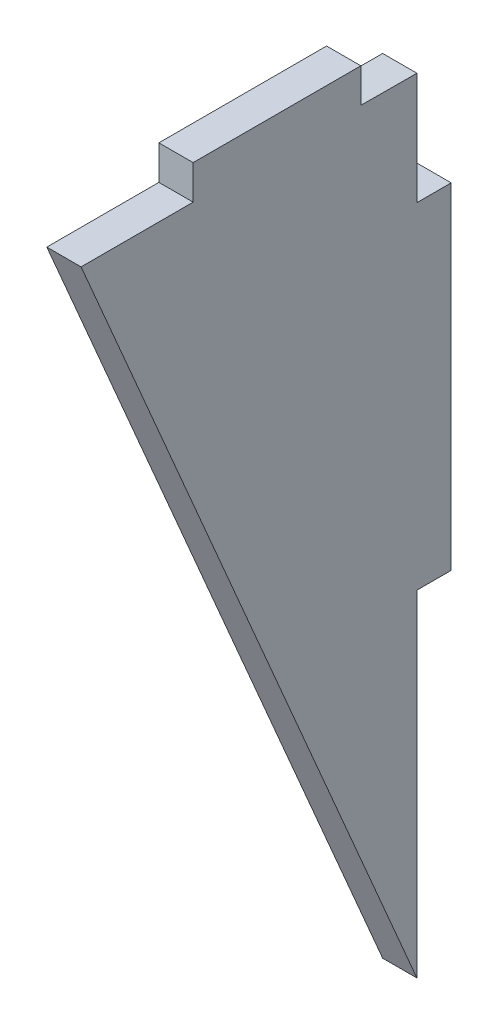
ISO-10303-21;
HEADER;
FILE_DESCRIPTION(('STEP AP214'),'2;1');
FILE_NAME('part.step','',(''),(''),'','','');
FILE_SCHEMA(('AUTOMOTIVE_DESIGN { 1 0 10303 214 1 1 1 1 }'));
ENDSEC;
DATA;
#1=APPLICATION_CONTEXT('core data for automotive mechanical design processes');
#2=APPLICATION_PROTOCOL_DEFINITION('international standard','automotive_design',2000,#1);
#3=PRODUCT_CONTEXT('',#1,'mechanical');
#4=PRODUCT('Part','Part','',(#3));
#5=PRODUCT_RELATED_PRODUCT_CATEGORY('part','',(#4));
#6=PRODUCT_DEFINITION_FORMATION('','',#4);
#7=PRODUCT_DEFINITION_CONTEXT('part definition',#1,'design');
#8=PRODUCT_DEFINITION('design','',#6,#7);
#9=PRODUCT_DEFINITION_SHAPE('','',#8);
#10=(LENGTH_UNIT() NAMED_UNIT(*) SI_UNIT(.MILLI.,.METRE.));
#11=(NAMED_UNIT(*) PLANE_ANGLE_UNIT() SI_UNIT($,.RADIAN.));
#12=(NAMED_UNIT(*) SI_UNIT($,.STERADIAN.) SOLID_ANGLE_UNIT());
#13=UNCERTAINTY_MEASURE_WITH_UNIT(LENGTH_MEASURE(1.E-05),#10,'distance_accuracy_value','');
#14=(GEOMETRIC_REPRESENTATION_CONTEXT(3) GLOBAL_UNCERTAINTY_ASSIGNED_CONTEXT((#13)) GLOBAL_UNIT_ASSIGNED_CONTEXT((#10,
#11,#12)) REPRESENTATION_CONTEXT('',''));
#15=CARTESIAN_POINT('',(0.,0.,0.));
#16=DIRECTION('',(0.,0.,1.));
#17=DIRECTION('',(1.,0.,0.));
#18=AXIS2_PLACEMENT_3D('',#15,#16,#17);
#19=CARTESIAN_POINT('',(40.0199999999999,-394.97,-32.1299999999999));
#20=DIRECTION('',(0.,0.,1.));
#21=DIRECTION('',(1.,0.,0.));
#22=AXIS2_PLACEMENT_3D('',#19,#20,#21);
#23=PLANE('',#22);
#24=DIRECTION('',(0.,-1.,0.));
#25=VECTOR('',#24,1.);
#26=CARTESIAN_POINT('',(43.0799999999999,-394.97,-32.1299999999999));
#27=LINE('',#26,#25);
#28=CARTESIAN_POINT('',(43.0799999999999,-364.99,-32.1299999999999));
#29=VERTEX_POINT('',#28);
#30=CARTESIAN_POINT('',(43.0799999999999,-394.97,-32.1299999999999));
#31=VERTEX_POINT('',#30);
#32=EDGE_CURVE('E157',#29,#31,#27,.T.);
#33=ORIENTED_EDGE('',*,*,#32,.T.);
#34=DIRECTION('',(1.,0.,0.));
#35=VECTOR('',#34,1.);
#36=CARTESIAN_POINT('',(40.0199999999999,-394.97,-32.1299999999999));
#37=LINE('',#36,#35);
#38=CARTESIAN_POINT('',(40.0199999999999,-394.97,-32.1299999999999));
#39=VERTEX_POINT('',#38);
#40=EDGE_CURVE('E11',#39,#31,#37,.T.);
#41=ORIENTED_EDGE('',*,*,#40,.F.);
#42=DIRECTION('',(0.,-1.,0.));
#43=VECTOR('',#42,1.);
#44=CARTESIAN_POINT('',(40.0199999999999,-394.97,-32.1299999999999));
#45=LINE('',#44,#43);
#46=CARTESIAN_POINT('',(40.0199999999999,-364.99,-32.1299999999999));
#47=VERTEX_POINT('',#46);
#48=EDGE_CURVE('E177',#47,#39,#45,.T.);
#49=ORIENTED_EDGE('',*,*,#48,.F.);
#50=DIRECTION('',(1.,0.,0.));
#51=VECTOR('',#50,1.);
#52=CARTESIAN_POINT('',(40.0199999999999,-364.99,-32.1299999999999));
#53=LINE('',#52,#51);
#54=EDGE_CURVE('E153',#47,#29,#53,.T.);
#55=ORIENTED_EDGE('',*,*,#54,.T.);
#56=EDGE_LOOP('',(#33,#41,#49,#55));
#57=FACE_BOUND('',#56,.T.);
#58=ADVANCED_FACE('F43',(#57),#23,.F.);
#59=CARTESIAN_POINT('',(40.0199999999999,-394.97,-29.0699999999999));
#60=DIRECTION('',(0.,1.,0.));
#61=DIRECTION('',(0.,0.,1.));
#62=AXIS2_PLACEMENT_3D('',#59,#60,#61);
#63=PLANE('',#62);
#64=DIRECTION('',(0.,0.,1.));
#65=VECTOR('',#64,1.);
#66=CARTESIAN_POINT('',(43.0799999999999,-394.97,-29.0699999999999));
#67=LINE('',#66,#65);
#68=CARTESIAN_POINT('',(43.0799999999999,-394.97,-29.0699999999999));
#69=VERTEX_POINT('',#68);
#70=EDGE_CURVE('E160',#31,#69,#67,.T.);
#71=ORIENTED_EDGE('',*,*,#70,.T.);
#72=DIRECTION('',(1.,0.,0.));
#73=VECTOR('',#72,1.);
#74=CARTESIAN_POINT('',(40.0199999999999,-394.97,-29.0699999999999));
#75=LINE('',#74,#73);
#76=CARTESIAN_POINT('',(40.0199999999999,-394.97,-29.0699999999999));
#77=VERTEX_POINT('',#76);
#78=EDGE_CURVE('E51',#77,#69,#75,.T.);
#79=ORIENTED_EDGE('',*,*,#78,.F.);
#80=DIRECTION('',(0.,0.,1.));
#81=VECTOR('',#80,1.);
#82=CARTESIAN_POINT('',(40.0199999999999,-394.97,-29.0699999999999));
#83=LINE('',#82,#81);
#84=EDGE_CURVE('E111',#39,#77,#83,.T.);
#85=ORIENTED_EDGE('',*,*,#84,.F.);
#86=ORIENTED_EDGE('',*,*,#40,.T.);
#87=EDGE_LOOP('',(#71,#79,#85,#86));
#88=FACE_BOUND('',#87,.T.);
#89=ADVANCED_FACE('F250',(#88),#63,.F.);
#90=CARTESIAN_POINT('',(40.0199999999999,-424.97,-29.0699999999999));
#91=DIRECTION('',(0.,0.,1.));
#92=DIRECTION('',(1.,0.,0.));
#93=AXIS2_PLACEMENT_3D('',#90,#91,#92);
#94=PLANE('',#93);
#95=DIRECTION('',(0.,-1.,0.));
#96=VECTOR('',#95,1.);
#97=CARTESIAN_POINT('',(43.0799999999999,-424.97,-29.0699999999999));
#98=LINE('',#97,#96);
#99=CARTESIAN_POINT('',(43.0799999999999,-424.97,-29.0699999999999));
#100=VERTEX_POINT('',#99);
#101=EDGE_CURVE('E162',#69,#100,#98,.T.);
#102=ORIENTED_EDGE('',*,*,#101,.T.);
#103=DIRECTION('',(1.,0.,0.));
#104=VECTOR('',#103,1.);
#105=CARTESIAN_POINT('',(40.0199999999999,-424.97,-29.0699999999999));
#106=LINE('',#105,#104);
#107=CARTESIAN_POINT('',(40.0199999999999,-424.97,-29.0699999999999));
#108=VERTEX_POINT('',#107);
#109=EDGE_CURVE('E193',#108,#100,#106,.T.);
#110=ORIENTED_EDGE('',*,*,#109,.F.);
#111=DIRECTION('',(0.,-1.,0.));
#112=VECTOR('',#111,1.);
#113=CARTESIAN_POINT('',(40.0199999999999,-424.97,-29.0699999999999));
#114=LINE('',#113,#112);
#115=EDGE_CURVE('E201',#77,#108,#114,.T.);
#116=ORIENTED_EDGE('',*,*,#115,.F.);
#117=ORIENTED_EDGE('',*,*,#78,.T.);
#118=EDGE_LOOP('',(#102,#110,#116,#117));
#119=FACE_BOUND('',#118,.T.);
#120=ADVANCED_FACE('F199',(#119),#94,.F.);
#121=CARTESIAN_POINT('',(40.0199999999999,-354.96,0.929999999999993));
#122=DIRECTION('',(0.,0.393871761805236,-0.919165401466156));
#123=DIRECTION('',(0.,0.919165401466156,0.393871761805236));
#124=AXIS2_PLACEMENT_3D('',#121,#122,#123);
#125=PLANE('',#124);
#126=DIRECTION('',(0.,0.919165401466156,0.393871761805236));
#127=VECTOR('',#126,1.);
#128=CARTESIAN_POINT('',(43.0799999999999,-354.96,0.929999999999993));
#129=LINE('',#128,#127);
#130=CARTESIAN_POINT('',(43.0799999999999,-354.96,0.929999999999993));
#131=VERTEX_POINT('',#130);
#132=EDGE_CURVE('E164',#100,#131,#129,.T.);
#133=ORIENTED_EDGE('',*,*,#132,.T.);
#134=DIRECTION('',(1.,0.,0.));
#135=VECTOR('',#134,1.);
#136=CARTESIAN_POINT('',(40.0199999999999,-354.96,0.929999999999993));
#137=LINE('',#136,#135);
#138=CARTESIAN_POINT('',(40.0199999999999,-354.96,0.929999999999993));
#139=VERTEX_POINT('',#138);
#140=EDGE_CURVE('E190',#139,#131,#137,.T.);
#141=ORIENTED_EDGE('',*,*,#140,.F.);
#142=DIRECTION('',(0.,0.919165401466156,0.393871761805236));
#143=VECTOR('',#142,1.);
#144=CARTESIAN_POINT('',(40.0199999999999,-354.96,0.929999999999993));
#145=LINE('',#144,#143);
#146=EDGE_CURVE('E219',#108,#139,#145,.T.);
#147=ORIENTED_EDGE('',*,*,#146,.F.);
#148=ORIENTED_EDGE('',*,*,#109,.T.);
#149=EDGE_LOOP('',(#133,#141,#147,#148));
#150=FACE_BOUND('',#149,.T.);
#151=ADVANCED_FACE('F210',(#150),#125,.F.);
#152=CARTESIAN_POINT('',(40.0199999999999,-354.96,-9.08000000000001));
#153=DIRECTION('',(0.,-1.,0.));
#154=DIRECTION('',(0.,0.,-1.));
#155=AXIS2_PLACEMENT_3D('',#152,#153,#154);
#156=PLANE('',#155);
#157=DIRECTION('',(0.,0.,-1.));
#158=VECTOR('',#157,1.);
#159=CARTESIAN_POINT('',(43.0799999999999,-354.96,-9.08000000000001));
#160=LINE('',#159,#158);
#161=CARTESIAN_POINT('',(43.0799999999999,-354.96,-9.08000000000001));
#162=VERTEX_POINT('',#161);
#163=EDGE_CURVE('E166',#131,#162,#160,.T.);
#164=ORIENTED_EDGE('',*,*,#163,.T.);
#165=DIRECTION('',(1.,0.,0.));
#166=VECTOR('',#165,1.);
#167=CARTESIAN_POINT('',(40.0199999999999,-354.96,-9.08000000000001));
#168=LINE('',#167,#166);
#169=CARTESIAN_POINT('',(40.0199999999999,-354.96,-9.08000000000001));
#170=VERTEX_POINT('',#169);
#171=EDGE_CURVE('E187',#170,#162,#168,.T.);
#172=ORIENTED_EDGE('',*,*,#171,.F.);
#173=DIRECTION('',(0.,0.,-1.));
#174=VECTOR('',#173,1.);
#175=CARTESIAN_POINT('',(40.0199999999999,-354.96,-9.08000000000001));
#176=LINE('',#175,#174);
#177=EDGE_CURVE('E216',#139,#170,#176,.T.);
#178=ORIENTED_EDGE('',*,*,#177,.F.);
#179=ORIENTED_EDGE('',*,*,#140,.T.);
#180=EDGE_LOOP('',(#164,#172,#178,#179));
#181=FACE_BOUND('',#180,.T.);
#182=ADVANCED_FACE('F214',(#181),#156,.F.);
#183=CARTESIAN_POINT('',(40.0199999999999,-351.9,-9.08000000000001));
#184=DIRECTION('',(0.,0.,-1.));
#185=DIRECTION('',(0.,1.,0.));
#186=AXIS2_PLACEMENT_3D('',#183,#184,#185);
#187=PLANE('',#186);
#188=DIRECTION('',(0.,1.,0.));
#189=VECTOR('',#188,1.);
#190=CARTESIAN_POINT('',(43.0799999999999,-351.9,-9.08000000000001));
#191=LINE('',#190,#189);
#192=CARTESIAN_POINT('',(43.0799999999999,-351.9,-9.08000000000001));
#193=VERTEX_POINT('',#192);
#194=EDGE_CURVE('E168',#162,#193,#191,.T.);
#195=ORIENTED_EDGE('',*,*,#194,.T.);
#196=DIRECTION('',(1.,0.,0.));
#197=VECTOR('',#196,1.);
#198=CARTESIAN_POINT('',(40.0199999999999,-351.9,-9.08000000000001));
#199=LINE('',#198,#197);
#200=CARTESIAN_POINT('',(40.0199999999999,-351.9,-9.08000000000001));
#201=VERTEX_POINT('',#200);
#202=EDGE_CURVE('E184',#201,#193,#199,.T.);
#203=ORIENTED_EDGE('',*,*,#202,.F.);
#204=DIRECTION('',(0.,1.,0.));
#205=VECTOR('',#204,1.);
#206=CARTESIAN_POINT('',(40.0199999999999,-351.9,-9.08000000000001));
#207=LINE('',#206,#205);
#208=EDGE_CURVE('E218',#170,#201,#207,.T.);
#209=ORIENTED_EDGE('',*,*,#208,.F.);
#210=ORIENTED_EDGE('',*,*,#171,.T.);
#211=EDGE_LOOP('',(#195,#203,#209,#210));
#212=FACE_BOUND('',#211,.T.);
#213=ADVANCED_FACE('F265',(#212),#187,.F.);
#214=CARTESIAN_POINT('',(40.0199999999999,-351.9,-24.06));
#215=DIRECTION('',(0.,-1.,0.));
#216=DIRECTION('',(0.,0.,-1.));
#217=AXIS2_PLACEMENT_3D('',#214,#215,#216);
#218=PLANE('',#217);
#219=DIRECTION('',(0.,0.,-1.));
#220=VECTOR('',#219,1.);
#221=CARTESIAN_POINT('',(43.0799999999999,-351.9,-24.06));
#222=LINE('',#221,#220);
#223=CARTESIAN_POINT('',(43.0799999999999,-351.9,-24.06));
#224=VERTEX_POINT('',#223);
#225=EDGE_CURVE('E170',#193,#224,#222,.T.);
#226=ORIENTED_EDGE('',*,*,#225,.T.);
#227=DIRECTION('',(1.,0.,0.));
#228=VECTOR('',#227,1.);
#229=CARTESIAN_POINT('',(40.0199999999999,-351.9,-24.06));
#230=LINE('',#229,#228);
#231=CARTESIAN_POINT('',(40.0199999999999,-351.9,-24.06));
#232=VERTEX_POINT('',#231);
#233=EDGE_CURVE('E181',#232,#224,#230,.T.);
#234=ORIENTED_EDGE('',*,*,#233,.F.);
#235=DIRECTION('',(0.,0.,-1.));
#236=VECTOR('',#235,1.);
#237=CARTESIAN_POINT('',(40.0199999999999,-351.9,-24.06));
#238=LINE('',#237,#236);
#239=EDGE_CURVE('E221',#201,#232,#238,.T.);
#240=ORIENTED_EDGE('',*,*,#239,.F.);
#241=ORIENTED_EDGE('',*,*,#202,.T.);
#242=EDGE_LOOP('',(#226,#234,#240,#241));
#243=FACE_BOUND('',#242,.T.);
#244=ADVANCED_FACE('F230',(#243),#218,.F.);
#245=CARTESIAN_POINT('',(40.0199999999999,-354.96,-24.06));
#246=DIRECTION('',(0.,0.,1.));
#247=DIRECTION('',(1.,0.,0.));
#248=AXIS2_PLACEMENT_3D('',#245,#246,#247);
#249=PLANE('',#248);
#250=DIRECTION('',(0.,-1.,0.));
#251=VECTOR('',#250,1.);
#252=CARTESIAN_POINT('',(43.0799999999999,-354.96,-24.06));
#253=LINE('',#252,#251);
#254=CARTESIAN_POINT('',(43.0799999999999,-354.96,-24.06));
#255=VERTEX_POINT('',#254);
#256=EDGE_CURVE('E172',#224,#255,#253,.T.);
#257=ORIENTED_EDGE('',*,*,#256,.T.);
#258=DIRECTION('',(1.,0.,0.));
#259=VECTOR('',#258,1.);
#260=CARTESIAN_POINT('',(40.0199999999999,-354.96,-24.06));
#261=LINE('',#260,#259);
#262=CARTESIAN_POINT('',(40.0199999999999,-354.96,-24.06));
#263=VERTEX_POINT('',#262);
#264=EDGE_CURVE('E148',#263,#255,#261,.T.);
#265=ORIENTED_EDGE('',*,*,#264,.F.);
#266=DIRECTION('',(0.,-1.,0.));
#267=VECTOR('',#266,1.);
#268=CARTESIAN_POINT('',(40.0199999999999,-354.96,-24.06));
#269=LINE('',#268,#267);
#270=EDGE_CURVE('E139',#232,#263,#269,.T.);
#271=ORIENTED_EDGE('',*,*,#270,.F.);
#272=ORIENTED_EDGE('',*,*,#233,.T.);
#273=EDGE_LOOP('',(#257,#265,#271,#272));
#274=FACE_BOUND('',#273,.T.);
#275=ADVANCED_FACE('F234',(#274),#249,.F.);
#276=CARTESIAN_POINT('',(40.0199999999999,-354.98,-29.0699999999999));
#277=DIRECTION('',(0.,-0.99999203199949,0.00399198415966056));
#278=DIRECTION('',(0.,-0.00399198415966056,-0.99999203199949));
#279=AXIS2_PLACEMENT_3D('',#276,#277,#278);
#280=PLANE('',#279);
#281=DIRECTION('',(0.,-0.00399198415966056,-0.99999203199949));
#282=VECTOR('',#281,1.);
#283=CARTESIAN_POINT('',(43.0799999999999,-354.98,-29.0699999999999));
#284=LINE('',#283,#282);
#285=CARTESIAN_POINT('',(43.0799999999999,-354.98,-29.0699999999999));
#286=VERTEX_POINT('',#285);
#287=EDGE_CURVE('E147',#255,#286,#284,.T.);
#288=ORIENTED_EDGE('',*,*,#287,.T.);
#289=DIRECTION('',(1.,0.,0.));
#290=VECTOR('',#289,1.);
#291=CARTESIAN_POINT('',(40.0199999999999,-354.98,-29.0699999999999));
#292=LINE('',#291,#290);
#293=CARTESIAN_POINT('',(40.0199999999999,-354.98,-29.0699999999999));
#294=VERTEX_POINT('',#293);
#295=EDGE_CURVE('E144',#294,#286,#292,.T.);
#296=ORIENTED_EDGE('',*,*,#295,.F.);
#297=DIRECTION('',(0.,-0.00399198415966056,-0.99999203199949));
#298=VECTOR('',#297,1.);
#299=CARTESIAN_POINT('',(40.0199999999999,-354.98,-29.0699999999999));
#300=LINE('',#299,#298);
#301=EDGE_CURVE('E133',#263,#294,#300,.T.);
#302=ORIENTED_EDGE('',*,*,#301,.F.);
#303=ORIENTED_EDGE('',*,*,#264,.T.);
#304=EDGE_LOOP('',(#288,#296,#302,#303));
#305=FACE_BOUND('',#304,.T.);
#306=ADVANCED_FACE('F145',(#305),#280,.F.);
#307=CARTESIAN_POINT('',(40.0199999999999,-364.99,-29.0699999999999));
#308=DIRECTION('',(0.,0.,1.));
#309=DIRECTION('',(1.,0.,0.));
#310=AXIS2_PLACEMENT_3D('',#307,#308,#309);
#311=PLANE('',#310);
#312=DIRECTION('',(0.,-1.,0.));
#313=VECTOR('',#312,1.);
#314=CARTESIAN_POINT('',(43.0799999999999,-364.99,-29.0699999999999));
#315=LINE('',#314,#313);
#316=CARTESIAN_POINT('',(43.0799999999999,-364.99,-29.0699999999999));
#317=VERTEX_POINT('',#316);
#318=EDGE_CURVE('E97',#286,#317,#315,.T.);
#319=ORIENTED_EDGE('',*,*,#318,.T.);
#320=DIRECTION('',(1.,0.,0.));
#321=VECTOR('',#320,1.);
#322=CARTESIAN_POINT('',(40.0199999999999,-364.99,-29.0699999999999));
#323=LINE('',#322,#321);
#324=CARTESIAN_POINT('',(40.0199999999999,-364.99,-29.0699999999999));
#325=VERTEX_POINT('',#324);
#326=EDGE_CURVE('E149',#325,#317,#323,.T.);
#327=ORIENTED_EDGE('',*,*,#326,.F.);
#328=DIRECTION('',(0.,-1.,0.));
#329=VECTOR('',#328,1.);
#330=CARTESIAN_POINT('',(40.0199999999999,-364.99,-29.0699999999999));
#331=LINE('',#330,#329);
#332=EDGE_CURVE('E137',#294,#325,#331,.T.);
#333=ORIENTED_EDGE('',*,*,#332,.F.);
#334=ORIENTED_EDGE('',*,*,#295,.T.);
#335=EDGE_LOOP('',(#319,#327,#333,#334));
#336=FACE_BOUND('',#335,.T.);
#337=ADVANCED_FACE('F151',(#336),#311,.F.);
#338=CARTESIAN_POINT('',(40.0199999999999,-364.99,-32.1299999999999));
#339=DIRECTION('',(0.,-1.,0.));
#340=DIRECTION('',(0.,0.,-1.));
#341=AXIS2_PLACEMENT_3D('',#338,#339,#340);
#342=PLANE('',#341);
#343=DIRECTION('',(0.,0.,-1.));
#344=VECTOR('',#343,1.);
#345=CARTESIAN_POINT('',(43.0799999999999,-364.99,-32.1299999999999));
#346=LINE('',#345,#344);
#347=EDGE_CURVE('E103',#317,#29,#346,.T.);
#348=ORIENTED_EDGE('',*,*,#347,.T.);
#349=ORIENTED_EDGE('',*,*,#54,.F.);
#350=DIRECTION('',(0.,0.,-1.));
#351=VECTOR('',#350,1.);
#352=CARTESIAN_POINT('',(40.0199999999999,-364.99,-32.1299999999999));
#353=LINE('',#352,#351);
#354=EDGE_CURVE('E59',#325,#47,#353,.T.);
#355=ORIENTED_EDGE('',*,*,#354,.F.);
#356=ORIENTED_EDGE('',*,*,#326,.T.);
#357=EDGE_LOOP('',(#348,#349,#355,#356));
#358=FACE_BOUND('',#357,.T.);
#359=ADVANCED_FACE('F238',(#358),#342,.F.);
#360=CARTESIAN_POINT('',(40.0199999999999,0.,0.));
#361=DIRECTION('',(1.,0.,0.));
#362=DIRECTION('',(0.,0.,-1.));
#363=AXIS2_PLACEMENT_3D('',#360,#361,#362);
#364=PLANE('',#363);
#365=ORIENTED_EDGE('',*,*,#48,.T.);
#366=ORIENTED_EDGE('',*,*,#84,.T.);
#367=ORIENTED_EDGE('',*,*,#115,.T.);
#368=ORIENTED_EDGE('',*,*,#146,.T.);
#369=ORIENTED_EDGE('',*,*,#177,.T.);
#370=ORIENTED_EDGE('',*,*,#208,.T.);
#371=ORIENTED_EDGE('',*,*,#239,.T.);
#372=ORIENTED_EDGE('',*,*,#270,.T.);
#373=ORIENTED_EDGE('',*,*,#301,.T.);
#374=ORIENTED_EDGE('',*,*,#332,.T.);
#375=ORIENTED_EDGE('',*,*,#354,.T.);
#376=EDGE_LOOP('',(#365,#366,#367,#368,#369,#370,#371,#372,#373,#374,#375));
#377=FACE_BOUND('',#376,.T.);
#378=ADVANCED_FACE('F135',(#377),#364,.F.);
#379=CARTESIAN_POINT('',(43.0799999999999,0.,0.));
#380=DIRECTION('',(1.,0.,0.));
#381=DIRECTION('',(0.,0.,-1.));
#382=AXIS2_PLACEMENT_3D('',#379,#380,#381);
#383=PLANE('',#382);
#384=ORIENTED_EDGE('',*,*,#32,.F.);
#385=ORIENTED_EDGE('',*,*,#347,.F.);
#386=ORIENTED_EDGE('',*,*,#318,.F.);
#387=ORIENTED_EDGE('',*,*,#287,.F.);
#388=ORIENTED_EDGE('',*,*,#256,.F.);
#389=ORIENTED_EDGE('',*,*,#225,.F.);
#390=ORIENTED_EDGE('',*,*,#194,.F.);
#391=ORIENTED_EDGE('',*,*,#163,.F.);
#392=ORIENTED_EDGE('',*,*,#132,.F.);
#393=ORIENTED_EDGE('',*,*,#101,.F.);
#394=ORIENTED_EDGE('',*,*,#70,.F.);
#395=EDGE_LOOP('',(#384,#385,#386,#387,#388,#389,#390,#391,#392,#393,#394));
#396=FACE_BOUND('',#395,.T.);
#397=ADVANCED_FACE('F205',(#396),#383,.T.);
#398=CLOSED_SHELL('',(#58,#89,#120,#151,#182,#213,#244,#275,#306,#337,#359,#378,#397));
#399=MANIFOLD_SOLID_BREP('B2',#398);
#400=ADVANCED_BREP_SHAPE_REPRESENTATION('',(#18,#399),#14);
#401=SHAPE_DEFINITION_REPRESENTATION(#9,#400);
ENDSEC;
END-ISO-10303-21;
